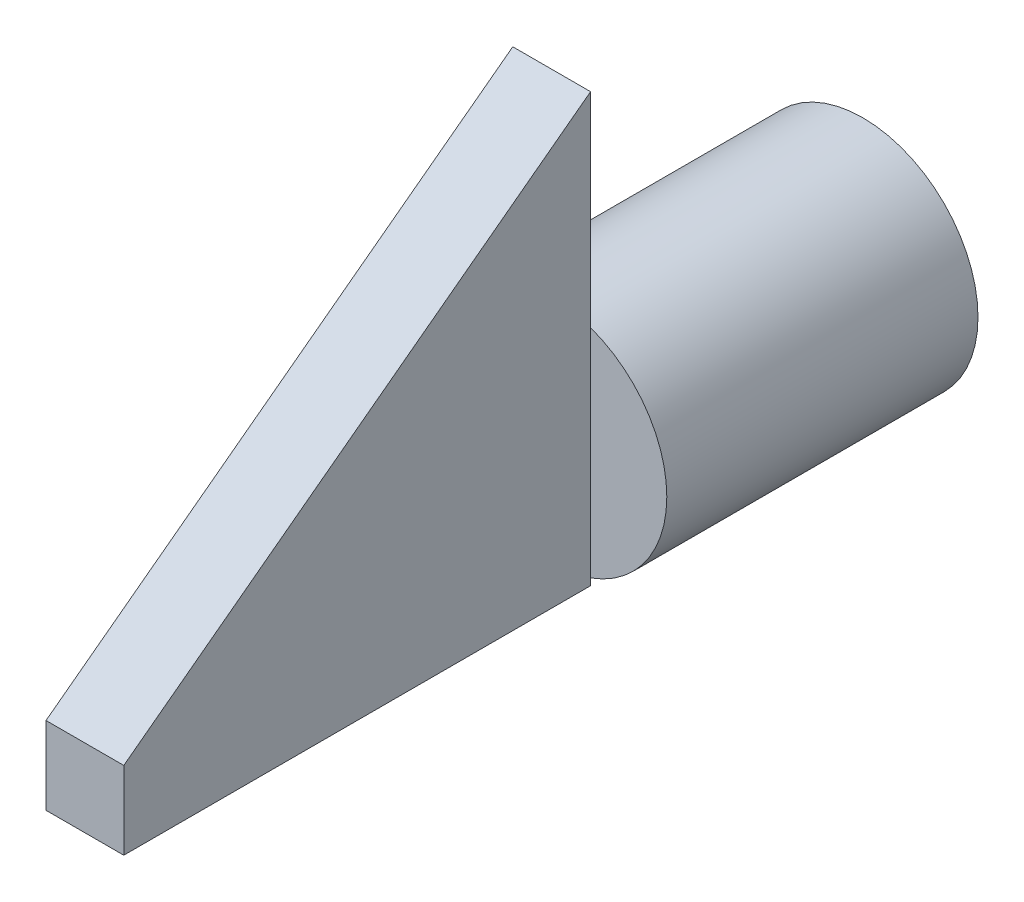
ISO-10303-21;
HEADER;
FILE_DESCRIPTION(('STEP AP214'),'2;1');
FILE_NAME('part.step','',(''),(''),'','','');
FILE_SCHEMA(('AUTOMOTIVE_DESIGN { 1 0 10303 214 1 1 1 1 }'));
ENDSEC;
DATA;
#1=APPLICATION_CONTEXT('core data for automotive mechanical design processes');
#2=APPLICATION_PROTOCOL_DEFINITION('international standard','automotive_design',2000,#1);
#3=PRODUCT_CONTEXT('',#1,'mechanical');
#4=PRODUCT('Part','Part','',(#3));
#5=PRODUCT_RELATED_PRODUCT_CATEGORY('part','',(#4));
#6=PRODUCT_DEFINITION_FORMATION('','',#4);
#7=PRODUCT_DEFINITION_CONTEXT('part definition',#1,'design');
#8=PRODUCT_DEFINITION('design','',#6,#7);
#9=PRODUCT_DEFINITION_SHAPE('','',#8);
#10=(LENGTH_UNIT() NAMED_UNIT(*) SI_UNIT(.MILLI.,.METRE.));
#11=(NAMED_UNIT(*) PLANE_ANGLE_UNIT() SI_UNIT($,.RADIAN.));
#12=(NAMED_UNIT(*) SI_UNIT($,.STERADIAN.) SOLID_ANGLE_UNIT());
#13=UNCERTAINTY_MEASURE_WITH_UNIT(LENGTH_MEASURE(1.E-05),#10,'distance_accuracy_value','');
#14=(GEOMETRIC_REPRESENTATION_CONTEXT(3) GLOBAL_UNCERTAINTY_ASSIGNED_CONTEXT((#13)) GLOBAL_UNIT_ASSIGNED_CONTEXT((#10,
#11,#12)) REPRESENTATION_CONTEXT('',''));
#15=CARTESIAN_POINT('',(0.,0.,0.));
#16=DIRECTION('',(0.,0.,1.));
#17=DIRECTION('',(1.,0.,0.));
#18=AXIS2_PLACEMENT_3D('',#15,#16,#17);
#19=CARTESIAN_POINT('',(0.,0.,0.));
#20=DIRECTION('',(0.,0.,1.));
#21=DIRECTION('',(1.,0.,0.));
#22=AXIS2_PLACEMENT_3D('',#19,#20,#21);
#23=PLANE('',#22);
#24=CARTESIAN_POINT('',(0.,0.,0.));
#25=DIRECTION('',(0.,0.,1.));
#26=DIRECTION('',(1.,0.,0.));
#27=AXIS2_PLACEMENT_3D('',#24,#25,#26);
#28=CIRCLE('',#27,9.398);
#29=CARTESIAN_POINT('',(9.398,0.,0.));
#30=VERTEX_POINT('',#29);
#31=EDGE_CURVE('E63',#30,#30,#28,.T.);
#32=ORIENTED_EDGE('',*,*,#31,.F.);
#33=EDGE_LOOP('',(#32));
#34=FACE_BOUND('',#33,.T.);
#35=ADVANCED_FACE('F17',(#34),#23,.F.);
#36=CARTESIAN_POINT('',(0.,0.,25.4));
#37=DIRECTION('',(0.,0.,1.));
#38=DIRECTION('',(1.,0.,0.));
#39=AXIS2_PLACEMENT_3D('',#36,#37,#38);
#40=PLANE('',#39);
#41=CARTESIAN_POINT('',(0.,0.,25.4));
#42=DIRECTION('',(0.,0.,1.));
#43=DIRECTION('',(1.,0.,0.));
#44=AXIS2_PLACEMENT_3D('',#41,#42,#43);
#45=CIRCLE('',#44,9.398);
#46=CARTESIAN_POINT('',(-3.175,-8.84543831587764,25.4));
#47=VERTEX_POINT('',#46);
#48=CARTESIAN_POINT('',(-3.175,8.84543831587764,25.4));
#49=VERTEX_POINT('',#48);
#50=EDGE_CURVE('E56',#47,#49,#45,.F.);
#51=ORIENTED_EDGE('',*,*,#50,.F.);
#52=DIRECTION('',(0.,1.,0.));
#53=VECTOR('',#52,1.);
#54=CARTESIAN_POINT('',(-3.175,0.,25.4));
#55=LINE('',#54,#53);
#56=EDGE_CURVE('E59',#47,#49,#55,.T.);
#57=ORIENTED_EDGE('',*,*,#56,.T.);
#58=EDGE_LOOP('',(#51,#57));
#59=FACE_BOUND('',#58,.T.);
#60=ADVANCED_FACE('F58',(#59),#40,.T.);
#61=CARTESIAN_POINT('',(-3.175,-9.398,25.4));
#62=DIRECTION('',(0.,0.,-1.));
#63=DIRECTION('',(-1.,0.,0.));
#64=AXIS2_PLACEMENT_3D('',#61,#62,#63);
#65=PLANE('',#64);
#66=DIRECTION('',(1.,0.,0.));
#67=VECTOR('',#66,1.);
#68=CARTESIAN_POINT('',(-3.175,-9.398,25.4));
#69=LINE('',#68,#67);
#70=CARTESIAN_POINT('',(0.,-9.398,25.4));
#71=VERTEX_POINT('',#70);
#72=CARTESIAN_POINT('',(3.175,-9.398,25.4));
#73=VERTEX_POINT('',#72);
#74=EDGE_CURVE('E117',#71,#73,#69,.T.);
#75=ORIENTED_EDGE('',*,*,#74,.F.);
#76=CARTESIAN_POINT('',(0.,0.,25.4));
#77=DIRECTION('',(0.,0.,1.));
#78=DIRECTION('',(1.,0.,0.));
#79=AXIS2_PLACEMENT_3D('',#76,#77,#78);
#80=CIRCLE('',#79,9.398);
#81=CARTESIAN_POINT('',(3.175,-8.84543831587764,25.4));
#82=VERTEX_POINT('',#81);
#83=EDGE_CURVE('E20',#82,#71,#80,.F.);
#84=ORIENTED_EDGE('',*,*,#83,.F.);
#85=DIRECTION('',(0.,1.,0.));
#86=VECTOR('',#85,1.);
#87=CARTESIAN_POINT('',(3.175,-9.398,25.4));
#88=LINE('',#87,#86);
#89=EDGE_CURVE('E73',#82,#73,#88,.F.);
#90=ORIENTED_EDGE('',*,*,#89,.T.);
#91=EDGE_LOOP('',(#75,#84,#90));
#92=FACE_BOUND('',#91,.T.);
#93=ADVANCED_FACE('F193',(#92),#65,.T.);
#94=CARTESIAN_POINT('',(-3.175,0.,0.));
#95=DIRECTION('',(1.,0.,0.));
#96=DIRECTION('',(0.,0.,-1.));
#97=AXIS2_PLACEMENT_3D('',#94,#95,#96);
#98=PLANE('',#97);
#99=DIRECTION('',(0.,0.,-1.));
#100=VECTOR('',#99,1.);
#101=CARTESIAN_POINT('',(-3.175,-9.398,63.5));
#102=LINE('',#101,#100);
#103=CARTESIAN_POINT('',(-3.175,-9.398,63.5));
#104=VERTEX_POINT('',#103);
#105=CARTESIAN_POINT('',(-3.175,-9.398,25.4));
#106=VERTEX_POINT('',#105);
#107=EDGE_CURVE('E123',#104,#106,#102,.T.);
#108=ORIENTED_EDGE('',*,*,#107,.F.);
#109=DIRECTION('',(0.,1.,0.));
#110=VECTOR('',#109,1.);
#111=CARTESIAN_POINT('',(-3.175,-3.048,63.5));
#112=LINE('',#111,#110);
#113=CARTESIAN_POINT('',(-3.175,-3.048,63.5));
#114=VERTEX_POINT('',#113);
#115=EDGE_CURVE('E99',#114,#104,#112,.F.);
#116=ORIENTED_EDGE('',*,*,#115,.F.);
#117=DIRECTION('',(0.,-0.6,0.8));
#118=VECTOR('',#117,1.);
#119=CARTESIAN_POINT('',(-3.175,25.527,25.4));
#120=LINE('',#119,#118);
#121=CARTESIAN_POINT('',(-3.175,25.527,25.4));
#122=VERTEX_POINT('',#121);
#123=EDGE_CURVE('E91',#122,#114,#120,.T.);
#124=ORIENTED_EDGE('',*,*,#123,.F.);
#125=DIRECTION('',(0.,1.,0.));
#126=VECTOR('',#125,1.);
#127=CARTESIAN_POINT('',(-3.175,-9.398,25.4));
#128=LINE('',#127,#126);
#129=EDGE_CURVE('E62',#49,#122,#128,.T.);
#130=ORIENTED_EDGE('',*,*,#129,.F.);
#131=ORIENTED_EDGE('',*,*,#56,.F.);
#132=DIRECTION('',(0.,1.,0.));
#133=VECTOR('',#132,1.);
#134=CARTESIAN_POINT('',(-3.175,-9.398,25.4));
#135=LINE('',#134,#133);
#136=EDGE_CURVE('E70',#106,#47,#135,.T.);
#137=ORIENTED_EDGE('',*,*,#136,.F.);
#138=EDGE_LOOP('',(#108,#116,#124,#130,#131,#137));
#139=FACE_BOUND('',#138,.T.);
#140=ADVANCED_FACE('F68',(#139),#98,.F.);
#141=CARTESIAN_POINT('',(-3.175,-9.398,25.4));
#142=DIRECTION('',(0.,0.,-1.));
#143=DIRECTION('',(-1.,0.,0.));
#144=AXIS2_PLACEMENT_3D('',#141,#142,#143);
#145=PLANE('',#144);
#146=ORIENTED_EDGE('',*,*,#136,.T.);
#147=CARTESIAN_POINT('',(0.,0.,25.4));
#148=DIRECTION('',(0.,0.,1.));
#149=DIRECTION('',(1.,0.,0.));
#150=AXIS2_PLACEMENT_3D('',#147,#148,#149);
#151=CIRCLE('',#150,9.398);
#152=EDGE_CURVE('E49',#71,#47,#151,.F.);
#153=ORIENTED_EDGE('',*,*,#152,.F.);
#154=DIRECTION('',(1.,0.,0.));
#155=VECTOR('',#154,1.);
#156=CARTESIAN_POINT('',(-3.175,-9.398,25.4));
#157=LINE('',#156,#155);
#158=EDGE_CURVE('E76',#106,#71,#157,.T.);
#159=ORIENTED_EDGE('',*,*,#158,.F.);
#160=EDGE_LOOP('',(#146,#153,#159));
#161=FACE_BOUND('',#160,.T.);
#162=ADVANCED_FACE('F75',(#161),#145,.T.);
#163=CARTESIAN_POINT('',(0.,0.,0.));
#164=DIRECTION('',(0.,0.,1.));
#165=DIRECTION('',(1.,0.,0.));
#166=AXIS2_PLACEMENT_3D('',#163,#164,#165);
#167=CYLINDRICAL_SURFACE('',#166,9.398);
#168=ORIENTED_EDGE('',*,*,#31,.T.);
#169=EDGE_LOOP('',(#168));
#170=FACE_BOUND('',#169,.T.);
#171=ORIENTED_EDGE('',*,*,#50,.T.);
#172=CARTESIAN_POINT('',(0.,0.,25.4));
#173=DIRECTION('',(0.,0.,1.));
#174=DIRECTION('',(1.,0.,0.));
#175=AXIS2_PLACEMENT_3D('',#172,#173,#174);
#176=CIRCLE('',#175,9.398);
#177=CARTESIAN_POINT('',(3.175,8.84543831587764,25.4));
#178=VERTEX_POINT('',#177);
#179=EDGE_CURVE('E84',#178,#49,#176,.T.);
#180=ORIENTED_EDGE('',*,*,#179,.F.);
#181=CARTESIAN_POINT('',(0.,0.,25.4));
#182=DIRECTION('',(0.,0.,1.));
#183=DIRECTION('',(1.,0.,0.));
#184=AXIS2_PLACEMENT_3D('',#181,#182,#183);
#185=CIRCLE('',#184,9.398);
#186=EDGE_CURVE('E35',#82,#178,#185,.T.);
#187=ORIENTED_EDGE('',*,*,#186,.F.);
#188=ORIENTED_EDGE('',*,*,#83,.T.);
#189=ORIENTED_EDGE('',*,*,#152,.T.);
#190=EDGE_LOOP('',(#171,#180,#187,#188,#189));
#191=FACE_BOUND('',#190,.T.);
#192=ADVANCED_FACE('F79',(#170,#191),#167,.T.);
#193=CARTESIAN_POINT('',(-3.175,-9.398,25.4));
#194=DIRECTION('',(0.,0.,-1.));
#195=DIRECTION('',(-1.,0.,0.));
#196=AXIS2_PLACEMENT_3D('',#193,#194,#195);
#197=PLANE('',#196);
#198=DIRECTION('',(0.,1.,0.));
#199=VECTOR('',#198,1.);
#200=CARTESIAN_POINT('',(3.175,0.,25.4));
#201=LINE('',#200,#199);
#202=CARTESIAN_POINT('',(3.175,25.527,25.4));
#203=VERTEX_POINT('',#202);
#204=EDGE_CURVE('E87',#178,#203,#201,.T.);
#205=ORIENTED_EDGE('',*,*,#204,.F.);
#206=ORIENTED_EDGE('',*,*,#179,.T.);
#207=ORIENTED_EDGE('',*,*,#129,.T.);
#208=DIRECTION('',(1.,0.,0.));
#209=VECTOR('',#208,1.);
#210=CARTESIAN_POINT('',(-3.175,25.527,25.4));
#211=LINE('',#210,#209);
#212=EDGE_CURVE('E86',#203,#122,#211,.F.);
#213=ORIENTED_EDGE('',*,*,#212,.F.);
#214=EDGE_LOOP('',(#205,#206,#207,#213));
#215=FACE_BOUND('',#214,.T.);
#216=ADVANCED_FACE('F161',(#215),#197,.T.);
#217=CARTESIAN_POINT('',(-3.175,25.527,25.4));
#218=DIRECTION('',(0.,0.8,0.6));
#219=DIRECTION('',(0.,-0.6,0.8));
#220=AXIS2_PLACEMENT_3D('',#217,#218,#219);
#221=PLANE('',#220);
#222=ORIENTED_EDGE('',*,*,#212,.T.);
#223=ORIENTED_EDGE('',*,*,#123,.T.);
#224=DIRECTION('',(1.,0.,0.));
#225=VECTOR('',#224,1.);
#226=CARTESIAN_POINT('',(-3.175,-3.048,63.5));
#227=LINE('',#226,#225);
#228=CARTESIAN_POINT('',(3.175,-3.048,63.5));
#229=VERTEX_POINT('',#228);
#230=EDGE_CURVE('E94',#229,#114,#227,.F.);
#231=ORIENTED_EDGE('',*,*,#230,.F.);
#232=DIRECTION('',(0.,-0.6,0.8));
#233=VECTOR('',#232,1.);
#234=CARTESIAN_POINT('',(3.175,25.527,25.4));
#235=LINE('',#234,#233);
#236=EDGE_CURVE('E108',#203,#229,#235,.T.);
#237=ORIENTED_EDGE('',*,*,#236,.F.);
#238=EDGE_LOOP('',(#222,#223,#231,#237));
#239=FACE_BOUND('',#238,.T.);
#240=ADVANCED_FACE('F179',(#239),#221,.T.);
#241=CARTESIAN_POINT('',(-3.175,-3.048,63.5));
#242=DIRECTION('',(0.,0.,1.));
#243=DIRECTION('',(1.,0.,0.));
#244=AXIS2_PLACEMENT_3D('',#241,#242,#243);
#245=PLANE('',#244);
#246=ORIENTED_EDGE('',*,*,#230,.T.);
#247=ORIENTED_EDGE('',*,*,#115,.T.);
#248=DIRECTION('',(1.,0.,0.));
#249=VECTOR('',#248,1.);
#250=CARTESIAN_POINT('',(-3.175,-9.398,63.5));
#251=LINE('',#250,#249);
#252=CARTESIAN_POINT('',(3.175,-9.398,63.5));
#253=VERTEX_POINT('',#252);
#254=EDGE_CURVE('E120',#253,#104,#251,.F.);
#255=ORIENTED_EDGE('',*,*,#254,.F.);
#256=DIRECTION('',(0.,1.,0.));
#257=VECTOR('',#256,1.);
#258=CARTESIAN_POINT('',(3.175,0.,63.5));
#259=LINE('',#258,#257);
#260=EDGE_CURVE('E105',#229,#253,#259,.F.);
#261=ORIENTED_EDGE('',*,*,#260,.F.);
#262=EDGE_LOOP('',(#246,#247,#255,#261));
#263=FACE_BOUND('',#262,.T.);
#264=ADVANCED_FACE('F173',(#263),#245,.T.);
#265=CARTESIAN_POINT('',(-3.175,-9.398,63.5));
#266=DIRECTION('',(0.,-1.,0.));
#267=DIRECTION('',(0.,0.,-1.));
#268=AXIS2_PLACEMENT_3D('',#265,#266,#267);
#269=PLANE('',#268);
#270=ORIENTED_EDGE('',*,*,#107,.T.);
#271=ORIENTED_EDGE('',*,*,#158,.T.);
#272=ORIENTED_EDGE('',*,*,#74,.T.);
#273=DIRECTION('',(0.,0.,-1.));
#274=VECTOR('',#273,1.);
#275=CARTESIAN_POINT('',(3.175,-9.398,0.));
#276=LINE('',#275,#274);
#277=EDGE_CURVE('E26',#253,#73,#276,.T.);
#278=ORIENTED_EDGE('',*,*,#277,.F.);
#279=ORIENTED_EDGE('',*,*,#254,.T.);
#280=EDGE_LOOP('',(#270,#271,#272,#278,#279));
#281=FACE_BOUND('',#280,.T.);
#282=ADVANCED_FACE('F165',(#281),#269,.T.);
#283=CARTESIAN_POINT('',(0.,0.,25.4));
#284=DIRECTION('',(0.,0.,1.));
#285=DIRECTION('',(1.,0.,0.));
#286=AXIS2_PLACEMENT_3D('',#283,#284,#285);
#287=PLANE('',#286);
#288=ORIENTED_EDGE('',*,*,#186,.T.);
#289=DIRECTION('',(0.,1.,0.));
#290=VECTOR('',#289,1.);
#291=CARTESIAN_POINT('',(3.175,0.,25.4));
#292=LINE('',#291,#290);
#293=EDGE_CURVE('E11',#82,#178,#292,.T.);
#294=ORIENTED_EDGE('',*,*,#293,.F.);
#295=EDGE_LOOP('',(#288,#294));
#296=FACE_BOUND('',#295,.T.);
#297=ADVANCED_FACE('F163',(#296),#287,.T.);
#298=CARTESIAN_POINT('',(3.175,0.,0.));
#299=DIRECTION('',(1.,0.,0.));
#300=DIRECTION('',(0.,0.,-1.));
#301=AXIS2_PLACEMENT_3D('',#298,#299,#300);
#302=PLANE('',#301);
#303=ORIENTED_EDGE('',*,*,#89,.F.);
#304=ORIENTED_EDGE('',*,*,#293,.T.);
#305=ORIENTED_EDGE('',*,*,#204,.T.);
#306=ORIENTED_EDGE('',*,*,#236,.T.);
#307=ORIENTED_EDGE('',*,*,#260,.T.);
#308=ORIENTED_EDGE('',*,*,#277,.T.);
#309=EDGE_LOOP('',(#303,#304,#305,#306,#307,#308));
#310=FACE_BOUND('',#309,.T.);
#311=ADVANCED_FACE('F153',(#310),#302,.T.);
#312=CLOSED_SHELL('',(#35,#60,#93,#140,#162,#192,#216,#240,#264,#282,#297,#311));
#313=MANIFOLD_SOLID_BREP('B1',#312);
#314=ADVANCED_BREP_SHAPE_REPRESENTATION('',(#18,#313),#14);
#315=SHAPE_DEFINITION_REPRESENTATION(#9,#314);
ENDSEC;
END-ISO-10303-21;
